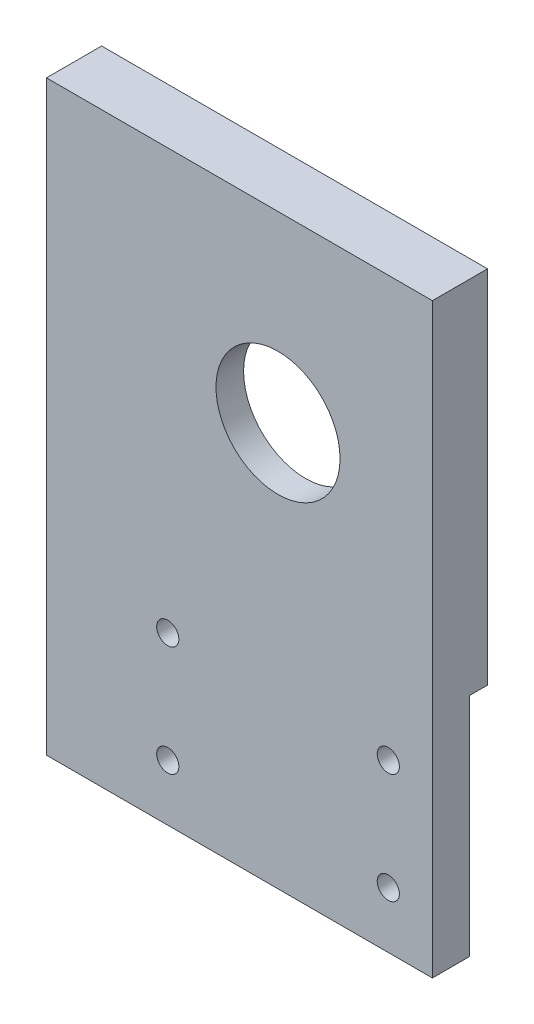
ISO-10303-21;
HEADER;
FILE_DESCRIPTION(('STEP AP214'),'2;1');
FILE_NAME('part.step','',(''),(''),'','','');
FILE_SCHEMA(('AUTOMOTIVE_DESIGN { 1 0 10303 214 1 1 1 1 }'));
ENDSEC;
DATA;
#1=APPLICATION_CONTEXT('core data for automotive mechanical design processes');
#2=APPLICATION_PROTOCOL_DEFINITION('international standard','automotive_design',2000,#1);
#3=PRODUCT_CONTEXT('',#1,'mechanical');
#4=PRODUCT('Part','Part','',(#3));
#5=PRODUCT_RELATED_PRODUCT_CATEGORY('part','',(#4));
#6=PRODUCT_DEFINITION_FORMATION('','',#4);
#7=PRODUCT_DEFINITION_CONTEXT('part definition',#1,'design');
#8=PRODUCT_DEFINITION('design','',#6,#7);
#9=PRODUCT_DEFINITION_SHAPE('','',#8);
#10=(LENGTH_UNIT() NAMED_UNIT(*) SI_UNIT(.MILLI.,.METRE.));
#11=(NAMED_UNIT(*) PLANE_ANGLE_UNIT() SI_UNIT($,.RADIAN.));
#12=(NAMED_UNIT(*) SI_UNIT($,.STERADIAN.) SOLID_ANGLE_UNIT());
#13=UNCERTAINTY_MEASURE_WITH_UNIT(LENGTH_MEASURE(1.E-05),#10,'distance_accuracy_value','');
#14=(GEOMETRIC_REPRESENTATION_CONTEXT(3) GLOBAL_UNCERTAINTY_ASSIGNED_CONTEXT((#13)) GLOBAL_UNIT_ASSIGNED_CONTEXT((#10,
#11,#12)) REPRESENTATION_CONTEXT('',''));
#15=CARTESIAN_POINT('',(0.,0.,0.));
#16=DIRECTION('',(0.,0.,1.));
#17=DIRECTION('',(1.,0.,0.));
#18=AXIS2_PLACEMENT_3D('',#15,#16,#17);
#19=CARTESIAN_POINT('',(0.,0.,-12.7));
#20=DIRECTION('',(1.,0.,0.));
#21=DIRECTION('',(0.,1.,0.));
#22=AXIS2_PLACEMENT_3D('',#19,#20,#21);
#23=PLANE('',#22);
#24=DIRECTION('',(0.,-1.,0.));
#25=VECTOR('',#24,1.);
#26=CARTESIAN_POINT('',(0.,-135.128,-8.5725));
#27=LINE('',#26,#25);
#28=CARTESIAN_POINT('',(0.,-83.058,-8.5725));
#29=VERTEX_POINT('',#28);
#30=CARTESIAN_POINT('',(0.,-135.128,-8.5725));
#31=VERTEX_POINT('',#30);
#32=EDGE_CURVE('E145',#29,#31,#27,.T.);
#33=ORIENTED_EDGE('',*,*,#32,.T.);
#34=DIRECTION('',(0.,0.,1.));
#35=VECTOR('',#34,1.);
#36=CARTESIAN_POINT('',(0.,-135.128,-12.7));
#37=LINE('',#36,#35);
#38=CARTESIAN_POINT('',(0.,-135.128,0.));
#39=VERTEX_POINT('',#38);
#40=EDGE_CURVE('E153',#31,#39,#37,.T.);
#41=ORIENTED_EDGE('',*,*,#40,.T.);
#42=DIRECTION('',(0.,-1.,0.));
#43=VECTOR('',#42,1.);
#44=CARTESIAN_POINT('',(0.,0.,0.));
#45=LINE('',#44,#43);
#46=CARTESIAN_POINT('',(0.,0.,0.));
#47=VERTEX_POINT('',#46);
#48=EDGE_CURVE('E205',#47,#39,#45,.T.);
#49=ORIENTED_EDGE('',*,*,#48,.F.);
#50=DIRECTION('',(0.,0.,1.));
#51=VECTOR('',#50,1.);
#52=CARTESIAN_POINT('',(0.,0.,-12.7));
#53=LINE('',#52,#51);
#54=CARTESIAN_POINT('',(0.,0.,-12.7));
#55=VERTEX_POINT('',#54);
#56=EDGE_CURVE('E214',#55,#47,#53,.T.);
#57=ORIENTED_EDGE('',*,*,#56,.F.);
#58=DIRECTION('',(0.,-1.,0.));
#59=VECTOR('',#58,1.);
#60=CARTESIAN_POINT('',(0.,0.,-12.7));
#61=LINE('',#60,#59);
#62=CARTESIAN_POINT('',(0.,-83.058,-12.7));
#63=VERTEX_POINT('',#62);
#64=EDGE_CURVE('E206',#55,#63,#61,.T.);
#65=ORIENTED_EDGE('',*,*,#64,.T.);
#66=DIRECTION('',(0.,0.,-1.));
#67=VECTOR('',#66,1.);
#68=CARTESIAN_POINT('',(0.,-83.058,-8.5725));
#69=LINE('',#68,#67);
#70=EDGE_CURVE('E165',#29,#63,#69,.T.);
#71=ORIENTED_EDGE('',*,*,#70,.F.);
#72=EDGE_LOOP('',(#33,#41,#49,#57,#65,#71));
#73=FACE_BOUND('',#72,.T.);
#74=ADVANCED_FACE('F39',(#73),#23,.F.);
#75=CARTESIAN_POINT('',(0.,-135.128,-12.7));
#76=DIRECTION('',(0.,1.,0.));
#77=DIRECTION('',(0.,0.,-1.));
#78=AXIS2_PLACEMENT_3D('',#75,#76,#77);
#79=PLANE('',#78);
#80=DIRECTION('',(0.,0.,1.));
#81=VECTOR('',#80,1.);
#82=CARTESIAN_POINT('',(88.9,-135.128,-12.7));
#83=LINE('',#82,#81);
#84=CARTESIAN_POINT('',(88.9,-135.128,-8.5725));
#85=VERTEX_POINT('',#84);
#86=CARTESIAN_POINT('',(88.9,-135.128,0.));
#87=VERTEX_POINT('',#86);
#88=EDGE_CURVE('E161',#85,#87,#83,.T.);
#89=ORIENTED_EDGE('',*,*,#88,.T.);
#90=DIRECTION('',(1.,0.,0.));
#91=VECTOR('',#90,1.);
#92=CARTESIAN_POINT('',(0.,-135.128,0.));
#93=LINE('',#92,#91);
#94=EDGE_CURVE('E156',#39,#87,#93,.T.);
#95=ORIENTED_EDGE('',*,*,#94,.F.);
#96=ORIENTED_EDGE('',*,*,#40,.F.);
#97=DIRECTION('',(1.,0.,0.));
#98=VECTOR('',#97,1.);
#99=CARTESIAN_POINT('',(0.,-135.128,-8.5725));
#100=LINE('',#99,#98);
#101=EDGE_CURVE('E141',#31,#85,#100,.T.);
#102=ORIENTED_EDGE('',*,*,#101,.T.);
#103=EDGE_LOOP('',(#89,#95,#96,#102));
#104=FACE_BOUND('',#103,.T.);
#105=ADVANCED_FACE('F154',(#104),#79,.F.);
#106=CARTESIAN_POINT('',(88.9,0.,-12.7));
#107=DIRECTION('',(-1.,0.,0.));
#108=DIRECTION('',(0.,-1.,0.));
#109=AXIS2_PLACEMENT_3D('',#106,#107,#108);
#110=PLANE('',#109);
#111=DIRECTION('',(0.,1.,0.));
#112=VECTOR('',#111,1.);
#113=CARTESIAN_POINT('',(88.9,0.,-12.7));
#114=LINE('',#113,#112);
#115=CARTESIAN_POINT('',(88.9,-83.058,-12.7));
#116=VERTEX_POINT('',#115);
#117=CARTESIAN_POINT('',(88.9,0.,-12.7));
#118=VERTEX_POINT('',#117);
#119=EDGE_CURVE('E208',#116,#118,#114,.T.);
#120=ORIENTED_EDGE('',*,*,#119,.T.);
#121=DIRECTION('',(0.,0.,1.));
#122=VECTOR('',#121,1.);
#123=CARTESIAN_POINT('',(88.9,0.,-12.7));
#124=LINE('',#123,#122);
#125=CARTESIAN_POINT('',(88.9,0.,0.));
#126=VERTEX_POINT('',#125);
#127=EDGE_CURVE('E223',#118,#126,#124,.T.);
#128=ORIENTED_EDGE('',*,*,#127,.T.);
#129=DIRECTION('',(0.,1.,0.));
#130=VECTOR('',#129,1.);
#131=CARTESIAN_POINT('',(88.9,0.,0.));
#132=LINE('',#131,#130);
#133=EDGE_CURVE('E217',#87,#126,#132,.T.);
#134=ORIENTED_EDGE('',*,*,#133,.F.);
#135=ORIENTED_EDGE('',*,*,#88,.F.);
#136=DIRECTION('',(0.,1.,0.));
#137=VECTOR('',#136,1.);
#138=CARTESIAN_POINT('',(88.9,-135.128,-8.5725));
#139=LINE('',#138,#137);
#140=CARTESIAN_POINT('',(88.9,-83.058,-8.5725));
#141=VERTEX_POINT('',#140);
#142=EDGE_CURVE('E147',#85,#141,#139,.T.);
#143=ORIENTED_EDGE('',*,*,#142,.T.);
#144=DIRECTION('',(0.,0.,-1.));
#145=VECTOR('',#144,1.);
#146=CARTESIAN_POINT('',(88.9,-83.058,-8.5725));
#147=LINE('',#146,#145);
#148=EDGE_CURVE('E174',#141,#116,#147,.T.);
#149=ORIENTED_EDGE('',*,*,#148,.T.);
#150=EDGE_LOOP('',(#120,#128,#134,#135,#143,#149));
#151=FACE_BOUND('',#150,.T.);
#152=ADVANCED_FACE('F307',(#151),#110,.F.);
#153=CARTESIAN_POINT('',(0.,0.,-12.7));
#154=DIRECTION('',(0.,-1.,0.));
#155=DIRECTION('',(0.,0.,1.));
#156=AXIS2_PLACEMENT_3D('',#153,#154,#155);
#157=PLANE('',#156);
#158=DIRECTION('',(-1.,0.,0.));
#159=VECTOR('',#158,1.);
#160=CARTESIAN_POINT('',(0.,0.,0.));
#161=LINE('',#160,#159);
#162=EDGE_CURVE('E209',#126,#47,#161,.T.);
#163=ORIENTED_EDGE('',*,*,#162,.F.);
#164=ORIENTED_EDGE('',*,*,#127,.F.);
#165=DIRECTION('',(-1.,0.,0.));
#166=VECTOR('',#165,1.);
#167=CARTESIAN_POINT('',(0.,0.,-12.7));
#168=LINE('',#167,#166);
#169=EDGE_CURVE('E212',#118,#55,#168,.T.);
#170=ORIENTED_EDGE('',*,*,#169,.T.);
#171=ORIENTED_EDGE('',*,*,#56,.T.);
#172=EDGE_LOOP('',(#163,#164,#170,#171));
#173=FACE_BOUND('',#172,.T.);
#174=ADVANCED_FACE('F312',(#173),#157,.F.);
#175=CARTESIAN_POINT('',(0.,0.,-12.7));
#176=DIRECTION('',(0.,0.,-1.));
#177=DIRECTION('',(1.,0.,0.));
#178=AXIS2_PLACEMENT_3D('',#175,#176,#177);
#179=PLANE('',#178);
#180=DIRECTION('',(-1.,0.,0.));
#181=VECTOR('',#180,1.);
#182=CARTESIAN_POINT('',(0.,-83.058,-12.7));
#183=LINE('',#182,#181);
#184=EDGE_CURVE('E54',#116,#63,#183,.T.);
#185=ORIENTED_EDGE('',*,*,#184,.T.);
#186=ORIENTED_EDGE('',*,*,#64,.F.);
#187=ORIENTED_EDGE('',*,*,#169,.F.);
#188=ORIENTED_EDGE('',*,*,#119,.F.);
#189=EDGE_LOOP('',(#185,#186,#187,#188));
#190=FACE_BOUND('',#189,.T.);
#191=DIRECTION('',(0.,1.,0.));
#192=VECTOR('',#191,1.);
#193=CARTESIAN_POINT('',(85.09,-73.914,-12.7));
#194=LINE('',#193,#192);
#195=CARTESIAN_POINT('',(85.09,-64.389,-12.7));
#196=VERTEX_POINT('',#195);
#197=CARTESIAN_POINT('',(85.09,-19.939,-12.7));
#198=VERTEX_POINT('',#197);
#199=EDGE_CURVE('E177',#196,#198,#194,.T.);
#200=ORIENTED_EDGE('',*,*,#199,.T.);
#201=CARTESIAN_POINT('',(75.565,-19.939,-12.7));
#202=DIRECTION('',(0.,0.,1.));
#203=DIRECTION('',(1.,0.,0.));
#204=AXIS2_PLACEMENT_3D('',#201,#202,#203);
#205=CIRCLE('',#204,9.525);
#206=CARTESIAN_POINT('',(75.565,-10.414,-12.7));
#207=VERTEX_POINT('',#206);
#208=EDGE_CURVE('E47',#207,#198,#205,.F.);
#209=ORIENTED_EDGE('',*,*,#208,.F.);
#210=DIRECTION('',(-1.,0.,0.));
#211=VECTOR('',#210,1.);
#212=CARTESIAN_POINT('',(21.59,-10.414,-12.7));
#213=LINE('',#212,#211);
#214=CARTESIAN_POINT('',(31.115,-10.414,-12.7));
#215=VERTEX_POINT('',#214);
#216=EDGE_CURVE('E194',#207,#215,#213,.T.);
#217=ORIENTED_EDGE('',*,*,#216,.T.);
#218=CARTESIAN_POINT('',(31.115,-19.939,-12.7));
#219=DIRECTION('',(0.,0.,1.));
#220=DIRECTION('',(1.,0.,0.));
#221=AXIS2_PLACEMENT_3D('',#218,#219,#220);
#222=CIRCLE('',#221,9.525);
#223=CARTESIAN_POINT('',(21.59,-19.939,-12.7));
#224=VERTEX_POINT('',#223);
#225=EDGE_CURVE('E11',#224,#215,#222,.F.);
#226=ORIENTED_EDGE('',*,*,#225,.F.);
#227=DIRECTION('',(0.,-1.,0.));
#228=VECTOR('',#227,1.);
#229=CARTESIAN_POINT('',(21.59,-73.914,-12.7));
#230=LINE('',#229,#228);
#231=CARTESIAN_POINT('',(21.59,-64.389,-12.7));
#232=VERTEX_POINT('',#231);
#233=EDGE_CURVE('E197',#224,#232,#230,.T.);
#234=ORIENTED_EDGE('',*,*,#233,.T.);
#235=CARTESIAN_POINT('',(31.115,-64.389,-12.7));
#236=DIRECTION('',(0.,0.,1.));
#237=DIRECTION('',(1.,0.,0.));
#238=AXIS2_PLACEMENT_3D('',#235,#236,#237);
#239=CIRCLE('',#238,9.525);
#240=CARTESIAN_POINT('',(31.115,-73.914,-12.7));
#241=VERTEX_POINT('',#240);
#242=EDGE_CURVE('E255',#241,#232,#239,.F.);
#243=ORIENTED_EDGE('',*,*,#242,.F.);
#244=DIRECTION('',(1.,0.,0.));
#245=VECTOR('',#244,1.);
#246=CARTESIAN_POINT('',(21.59,-73.914,-12.7));
#247=LINE('',#246,#245);
#248=CARTESIAN_POINT('',(75.565,-73.914,-12.7));
#249=VERTEX_POINT('',#248);
#250=EDGE_CURVE('E183',#241,#249,#247,.T.);
#251=ORIENTED_EDGE('',*,*,#250,.T.);
#252=CARTESIAN_POINT('',(75.565,-64.389,-12.7));
#253=DIRECTION('',(0.,0.,1.));
#254=DIRECTION('',(1.,0.,0.));
#255=AXIS2_PLACEMENT_3D('',#252,#253,#254);
#256=CIRCLE('',#255,9.525);
#257=EDGE_CURVE('E258',#196,#249,#256,.F.);
#258=ORIENTED_EDGE('',*,*,#257,.F.);
#259=EDGE_LOOP('',(#200,#209,#217,#226,#234,#243,#251,#258));
#260=FACE_BOUND('',#259,.T.);
#261=ADVANCED_FACE('F267',(#190,#260),#179,.T.);
#262=CARTESIAN_POINT('',(0.,0.,0.));
#263=DIRECTION('',(0.,0.,-1.));
#264=DIRECTION('',(1.,0.,0.));
#265=AXIS2_PLACEMENT_3D('',#262,#263,#264);
#266=PLANE('',#265);
#267=CARTESIAN_POINT('',(78.74,-96.774,0.));
#268=DIRECTION('',(0.,0.,-1.));
#269=DIRECTION('',(-1.,0.,0.));
#270=AXIS2_PLACEMENT_3D('',#267,#268,#269);
#271=CIRCLE('',#270,2.55269999999999);
#272=CARTESIAN_POINT('',(76.1873,-96.774,0.));
#273=VERTEX_POINT('',#272);
#274=EDGE_CURVE('E364',#273,#273,#271,.T.);
#275=ORIENTED_EDGE('',*,*,#274,.T.);
#276=EDGE_LOOP('',(#275));
#277=FACE_BOUND('',#276,.T.);
#278=CARTESIAN_POINT('',(78.74,-122.174,0.));
#279=DIRECTION('',(0.,0.,-1.));
#280=DIRECTION('',(-1.,0.,0.));
#281=AXIS2_PLACEMENT_3D('',#278,#279,#280);
#282=CIRCLE('',#281,2.55269999999999);
#283=CARTESIAN_POINT('',(76.1873,-122.174,0.));
#284=VERTEX_POINT('',#283);
#285=EDGE_CURVE('E374',#284,#284,#282,.T.);
#286=ORIENTED_EDGE('',*,*,#285,.T.);
#287=EDGE_LOOP('',(#286));
#288=FACE_BOUND('',#287,.T.);
#289=CARTESIAN_POINT('',(27.94,-122.174,0.));
#290=DIRECTION('',(0.,0.,-1.));
#291=DIRECTION('',(-1.,0.,0.));
#292=AXIS2_PLACEMENT_3D('',#289,#290,#291);
#293=CIRCLE('',#292,2.5527);
#294=CARTESIAN_POINT('',(25.3873,-122.174,0.));
#295=VERTEX_POINT('',#294);
#296=EDGE_CURVE('E380',#295,#295,#293,.T.);
#297=ORIENTED_EDGE('',*,*,#296,.T.);
#298=EDGE_LOOP('',(#297));
#299=FACE_BOUND('',#298,.T.);
#300=CARTESIAN_POINT('',(27.94,-96.774,0.));
#301=DIRECTION('',(0.,0.,-1.));
#302=DIRECTION('',(-1.,0.,0.));
#303=AXIS2_PLACEMENT_3D('',#300,#301,#302);
#304=CIRCLE('',#303,2.5527);
#305=CARTESIAN_POINT('',(25.3873,-96.774,0.));
#306=VERTEX_POINT('',#305);
#307=EDGE_CURVE('E167',#306,#306,#304,.T.);
#308=ORIENTED_EDGE('',*,*,#307,.T.);
#309=EDGE_LOOP('',(#308));
#310=FACE_BOUND('',#309,.T.);
#311=CARTESIAN_POINT('',(53.34,-42.164,0.));
#312=DIRECTION('',(0.,0.,1.));
#313=DIRECTION('',(1.,0.,0.));
#314=AXIS2_PLACEMENT_3D('',#311,#312,#313);
#315=CIRCLE('',#314,14.2875);
#316=CARTESIAN_POINT('',(67.6275,-42.164,0.));
#317=VERTEX_POINT('',#316);
#318=EDGE_CURVE('E202',#317,#317,#315,.T.);
#319=ORIENTED_EDGE('',*,*,#318,.F.);
#320=EDGE_LOOP('',(#319));
#321=FACE_BOUND('',#320,.T.);
#322=ORIENTED_EDGE('',*,*,#48,.T.);
#323=ORIENTED_EDGE('',*,*,#94,.T.);
#324=ORIENTED_EDGE('',*,*,#133,.T.);
#325=ORIENTED_EDGE('',*,*,#162,.T.);
#326=EDGE_LOOP('',(#322,#323,#324,#325));
#327=FACE_BOUND('',#326,.T.);
#328=ADVANCED_FACE('F317',(#277,#288,#299,#310,#321,#327),#266,.F.);
#329=CARTESIAN_POINT('',(53.34,-42.164,0.));
#330=DIRECTION('',(0.,0.,-1.));
#331=DIRECTION('',(1.,0.,0.));
#332=AXIS2_PLACEMENT_3D('',#329,#330,#331);
#333=CYLINDRICAL_SURFACE('',#332,14.2875);
#334=CARTESIAN_POINT('',(53.34,-42.164,-6.35));
#335=DIRECTION('',(0.,0.,-1.));
#336=DIRECTION('',(-1.,0.,0.));
#337=AXIS2_PLACEMENT_3D('',#334,#335,#336);
#338=CIRCLE('',#337,14.2875);
#339=CARTESIAN_POINT('',(39.0525,-42.164,-6.35));
#340=VERTEX_POINT('',#339);
#341=EDGE_CURVE('E191',#340,#340,#338,.F.);
#342=ORIENTED_EDGE('',*,*,#341,.F.);
#343=EDGE_LOOP('',(#342));
#344=FACE_BOUND('',#343,.T.);
#345=ORIENTED_EDGE('',*,*,#318,.T.);
#346=EDGE_LOOP('',(#345));
#347=FACE_BOUND('',#346,.T.);
#348=ADVANCED_FACE('F320',(#344,#347),#333,.F.);
#349=CARTESIAN_POINT('',(0.,0.,-6.35));
#350=DIRECTION('',(0.,0.,1.));
#351=DIRECTION('',(-1.,0.,0.));
#352=AXIS2_PLACEMENT_3D('',#349,#350,#351);
#353=PLANE('',#352);
#354=DIRECTION('',(0.,-1.,0.));
#355=VECTOR('',#354,1.);
#356=CARTESIAN_POINT('',(21.59,-73.914,-6.35));
#357=LINE('',#356,#355);
#358=CARTESIAN_POINT('',(21.59,-19.939,-6.35));
#359=VERTEX_POINT('',#358);
#360=CARTESIAN_POINT('',(21.59,-64.389,-6.35));
#361=VERTEX_POINT('',#360);
#362=EDGE_CURVE('E185',#359,#361,#357,.T.);
#363=ORIENTED_EDGE('',*,*,#362,.F.);
#364=CARTESIAN_POINT('',(31.115,-19.939,-6.35));
#365=DIRECTION('',(0.,0.,-1.));
#366=DIRECTION('',(-1.,0.,0.));
#367=AXIS2_PLACEMENT_3D('',#364,#365,#366);
#368=CIRCLE('',#367,9.525);
#369=CARTESIAN_POINT('',(31.115,-10.414,-6.35));
#370=VERTEX_POINT('',#369);
#371=EDGE_CURVE('E236',#370,#359,#368,.F.);
#372=ORIENTED_EDGE('',*,*,#371,.F.);
#373=DIRECTION('',(-1.,0.,0.));
#374=VECTOR('',#373,1.);
#375=CARTESIAN_POINT('',(21.59,-10.414,-6.35));
#376=LINE('',#375,#374);
#377=CARTESIAN_POINT('',(75.565,-10.414,-6.35));
#378=VERTEX_POINT('',#377);
#379=EDGE_CURVE('E182',#378,#370,#376,.T.);
#380=ORIENTED_EDGE('',*,*,#379,.F.);
#381=CARTESIAN_POINT('',(75.565,-19.939,-6.35));
#382=DIRECTION('',(0.,0.,-1.));
#383=DIRECTION('',(-1.,0.,0.));
#384=AXIS2_PLACEMENT_3D('',#381,#382,#383);
#385=CIRCLE('',#384,9.525);
#386=CARTESIAN_POINT('',(85.09,-19.939,-6.35));
#387=VERTEX_POINT('',#386);
#388=EDGE_CURVE('E239',#387,#378,#385,.F.);
#389=ORIENTED_EDGE('',*,*,#388,.F.);
#390=DIRECTION('',(0.,1.,0.));
#391=VECTOR('',#390,1.);
#392=CARTESIAN_POINT('',(85.09,-73.914,-6.35));
#393=LINE('',#392,#391);
#394=CARTESIAN_POINT('',(85.09,-64.389,-6.35));
#395=VERTEX_POINT('',#394);
#396=EDGE_CURVE('E179',#395,#387,#393,.T.);
#397=ORIENTED_EDGE('',*,*,#396,.F.);
#398=CARTESIAN_POINT('',(75.565,-64.389,-6.35));
#399=DIRECTION('',(0.,0.,-1.));
#400=DIRECTION('',(-1.,0.,0.));
#401=AXIS2_PLACEMENT_3D('',#398,#399,#400);
#402=CIRCLE('',#401,9.525);
#403=CARTESIAN_POINT('',(75.565,-73.914,-6.35));
#404=VERTEX_POINT('',#403);
#405=EDGE_CURVE('E242',#404,#395,#402,.F.);
#406=ORIENTED_EDGE('',*,*,#405,.F.);
#407=DIRECTION('',(1.,0.,0.));
#408=VECTOR('',#407,1.);
#409=CARTESIAN_POINT('',(21.59,-73.914,-6.35));
#410=LINE('',#409,#408);
#411=CARTESIAN_POINT('',(31.115,-73.914,-6.35));
#412=VERTEX_POINT('',#411);
#413=EDGE_CURVE('E188',#412,#404,#410,.T.);
#414=ORIENTED_EDGE('',*,*,#413,.F.);
#415=CARTESIAN_POINT('',(31.115,-64.389,-6.35));
#416=DIRECTION('',(0.,0.,-1.));
#417=DIRECTION('',(-1.,0.,0.));
#418=AXIS2_PLACEMENT_3D('',#415,#416,#417);
#419=CIRCLE('',#418,9.525);
#420=EDGE_CURVE('E245',#361,#412,#419,.F.);
#421=ORIENTED_EDGE('',*,*,#420,.F.);
#422=EDGE_LOOP('',(#363,#372,#380,#389,#397,#406,#414,#421));
#423=FACE_BOUND('',#422,.T.);
#424=ORIENTED_EDGE('',*,*,#341,.T.);
#425=EDGE_LOOP('',(#424));
#426=FACE_BOUND('',#425,.T.);
#427=ADVANCED_FACE('F276',(#423,#426),#353,.F.);
#428=CARTESIAN_POINT('',(85.09,-73.914,-6.35));
#429=DIRECTION('',(1.,0.,0.));
#430=DIRECTION('',(0.,0.,1.));
#431=AXIS2_PLACEMENT_3D('',#428,#429,#430);
#432=PLANE('',#431);
#433=ORIENTED_EDGE('',*,*,#396,.T.);
#434=DIRECTION('',(0.,0.,-1.));
#435=VECTOR('',#434,1.);
#436=CARTESIAN_POINT('',(85.09,-19.939,-6.35));
#437=LINE('',#436,#435);
#438=EDGE_CURVE('E248',#198,#387,#437,.F.);
#439=ORIENTED_EDGE('',*,*,#438,.F.);
#440=ORIENTED_EDGE('',*,*,#199,.F.);
#441=DIRECTION('',(0.,0.,-1.));
#442=VECTOR('',#441,1.);
#443=CARTESIAN_POINT('',(85.09,-64.389,-12.7));
#444=LINE('',#443,#442);
#445=EDGE_CURVE('E250',#395,#196,#444,.T.);
#446=ORIENTED_EDGE('',*,*,#445,.F.);
#447=EDGE_LOOP('',(#433,#439,#440,#446));
#448=FACE_BOUND('',#447,.T.);
#449=ADVANCED_FACE('F269',(#448),#432,.F.);
#450=CARTESIAN_POINT('',(21.59,-73.914,-6.35));
#451=DIRECTION('',(0.,-1.,0.));
#452=DIRECTION('',(0.,0.,1.));
#453=AXIS2_PLACEMENT_3D('',#450,#451,#452);
#454=PLANE('',#453);
#455=ORIENTED_EDGE('',*,*,#413,.T.);
#456=DIRECTION('',(0.,0.,-1.));
#457=VECTOR('',#456,1.);
#458=CARTESIAN_POINT('',(75.565,-73.914,-6.35));
#459=LINE('',#458,#457);
#460=EDGE_CURVE('E160',#249,#404,#459,.F.);
#461=ORIENTED_EDGE('',*,*,#460,.F.);
#462=ORIENTED_EDGE('',*,*,#250,.F.);
#463=DIRECTION('',(0.,0.,-1.));
#464=VECTOR('',#463,1.);
#465=CARTESIAN_POINT('',(31.115,-73.914,-12.7));
#466=LINE('',#465,#464);
#467=EDGE_CURVE('E230',#412,#241,#466,.T.);
#468=ORIENTED_EDGE('',*,*,#467,.F.);
#469=EDGE_LOOP('',(#455,#461,#462,#468));
#470=FACE_BOUND('',#469,.T.);
#471=ADVANCED_FACE('F291',(#470),#454,.F.);
#472=CARTESIAN_POINT('',(21.59,-73.914,-6.35));
#473=DIRECTION('',(-1.,0.,0.));
#474=DIRECTION('',(0.,0.,-1.));
#475=AXIS2_PLACEMENT_3D('',#472,#473,#474);
#476=PLANE('',#475);
#477=ORIENTED_EDGE('',*,*,#233,.F.);
#478=DIRECTION('',(0.,0.,-1.));
#479=VECTOR('',#478,1.);
#480=CARTESIAN_POINT('',(21.59,-19.939,-12.7));
#481=LINE('',#480,#479);
#482=EDGE_CURVE('E232',#359,#224,#481,.T.);
#483=ORIENTED_EDGE('',*,*,#482,.F.);
#484=ORIENTED_EDGE('',*,*,#362,.T.);
#485=DIRECTION('',(0.,0.,-1.));
#486=VECTOR('',#485,1.);
#487=CARTESIAN_POINT('',(21.59,-64.389,-6.35));
#488=LINE('',#487,#486);
#489=EDGE_CURVE('E234',#232,#361,#488,.F.);
#490=ORIENTED_EDGE('',*,*,#489,.F.);
#491=EDGE_LOOP('',(#477,#483,#484,#490));
#492=FACE_BOUND('',#491,.T.);
#493=ADVANCED_FACE('F285',(#492),#476,.F.);
#494=CARTESIAN_POINT('',(21.59,-10.414,-6.35));
#495=DIRECTION('',(0.,1.,0.));
#496=DIRECTION('',(0.,0.,-1.));
#497=AXIS2_PLACEMENT_3D('',#494,#495,#496);
#498=PLANE('',#497);
#499=ORIENTED_EDGE('',*,*,#379,.T.);
#500=DIRECTION('',(0.,0.,-1.));
#501=VECTOR('',#500,1.);
#502=CARTESIAN_POINT('',(31.115,-10.414,-6.35));
#503=LINE('',#502,#501);
#504=EDGE_CURVE('E62',#215,#370,#503,.F.);
#505=ORIENTED_EDGE('',*,*,#504,.F.);
#506=ORIENTED_EDGE('',*,*,#216,.F.);
#507=DIRECTION('',(0.,0.,-1.));
#508=VECTOR('',#507,1.);
#509=CARTESIAN_POINT('',(75.565,-10.414,-12.7));
#510=LINE('',#509,#508);
#511=EDGE_CURVE('E253',#378,#207,#510,.T.);
#512=ORIENTED_EDGE('',*,*,#511,.F.);
#513=EDGE_LOOP('',(#499,#505,#506,#512));
#514=FACE_BOUND('',#513,.T.);
#515=ADVANCED_FACE('F279',(#514),#498,.F.);
#516=CARTESIAN_POINT('',(31.115,-64.389,-6.35));
#517=DIRECTION('',(0.,0.,1.));
#518=DIRECTION('',(-1.,0.,0.));
#519=AXIS2_PLACEMENT_3D('',#516,#517,#518);
#520=CYLINDRICAL_SURFACE('',#519,9.525);
#521=ORIENTED_EDGE('',*,*,#420,.T.);
#522=ORIENTED_EDGE('',*,*,#467,.T.);
#523=ORIENTED_EDGE('',*,*,#242,.T.);
#524=ORIENTED_EDGE('',*,*,#489,.T.);
#525=EDGE_LOOP('',(#521,#522,#523,#524));
#526=FACE_BOUND('',#525,.T.);
#527=ADVANCED_FACE('F288',(#526),#520,.F.);
#528=CARTESIAN_POINT('',(75.565,-64.389,-6.35));
#529=DIRECTION('',(0.,0.,1.));
#530=DIRECTION('',(-1.,0.,0.));
#531=AXIS2_PLACEMENT_3D('',#528,#529,#530);
#532=CYLINDRICAL_SURFACE('',#531,9.525);
#533=ORIENTED_EDGE('',*,*,#405,.T.);
#534=ORIENTED_EDGE('',*,*,#445,.T.);
#535=ORIENTED_EDGE('',*,*,#257,.T.);
#536=ORIENTED_EDGE('',*,*,#460,.T.);
#537=EDGE_LOOP('',(#533,#534,#535,#536));
#538=FACE_BOUND('',#537,.T.);
#539=ADVANCED_FACE('F294',(#538),#532,.F.);
#540=CARTESIAN_POINT('',(75.565,-19.939,-6.35));
#541=DIRECTION('',(0.,0.,1.));
#542=DIRECTION('',(-1.,0.,0.));
#543=AXIS2_PLACEMENT_3D('',#540,#541,#542);
#544=CYLINDRICAL_SURFACE('',#543,9.525);
#545=ORIENTED_EDGE('',*,*,#388,.T.);
#546=ORIENTED_EDGE('',*,*,#511,.T.);
#547=ORIENTED_EDGE('',*,*,#208,.T.);
#548=ORIENTED_EDGE('',*,*,#438,.T.);
#549=EDGE_LOOP('',(#545,#546,#547,#548));
#550=FACE_BOUND('',#549,.T.);
#551=ADVANCED_FACE('F263',(#550),#544,.F.);
#552=CARTESIAN_POINT('',(31.115,-19.939,-6.35));
#553=DIRECTION('',(0.,0.,1.));
#554=DIRECTION('',(-1.,0.,0.));
#555=AXIS2_PLACEMENT_3D('',#552,#553,#554);
#556=CYLINDRICAL_SURFACE('',#555,9.525);
#557=ORIENTED_EDGE('',*,*,#371,.T.);
#558=ORIENTED_EDGE('',*,*,#482,.T.);
#559=ORIENTED_EDGE('',*,*,#225,.T.);
#560=ORIENTED_EDGE('',*,*,#504,.T.);
#561=EDGE_LOOP('',(#557,#558,#559,#560));
#562=FACE_BOUND('',#561,.T.);
#563=ADVANCED_FACE('F41',(#562),#556,.F.);
#564=CARTESIAN_POINT('',(0.,0.,-8.5725));
#565=DIRECTION('',(0.,0.,1.));
#566=DIRECTION('',(-1.,0.,0.));
#567=AXIS2_PLACEMENT_3D('',#564,#565,#566);
#568=PLANE('',#567);
#569=CARTESIAN_POINT('',(78.74,-96.774,-8.5725));
#570=DIRECTION('',(0.,0.,-1.));
#571=DIRECTION('',(-1.,0.,0.));
#572=AXIS2_PLACEMENT_3D('',#569,#570,#571);
#573=CIRCLE('',#572,2.55269999999999);
#574=CARTESIAN_POINT('',(76.1873,-96.774,-8.5725));
#575=VERTEX_POINT('',#574);
#576=EDGE_CURVE('E367',#575,#575,#573,.T.);
#577=ORIENTED_EDGE('',*,*,#576,.F.);
#578=EDGE_LOOP('',(#577));
#579=FACE_BOUND('',#578,.T.);
#580=CARTESIAN_POINT('',(78.74,-122.174,-8.5725));
#581=DIRECTION('',(0.,0.,-1.));
#582=DIRECTION('',(-1.,0.,0.));
#583=AXIS2_PLACEMENT_3D('',#580,#581,#582);
#584=CIRCLE('',#583,2.55269999999999);
#585=CARTESIAN_POINT('',(76.1873,-122.174,-8.5725));
#586=VERTEX_POINT('',#585);
#587=EDGE_CURVE('E369',#586,#586,#584,.T.);
#588=ORIENTED_EDGE('',*,*,#587,.F.);
#589=EDGE_LOOP('',(#588));
#590=FACE_BOUND('',#589,.T.);
#591=CARTESIAN_POINT('',(27.94,-122.174,-8.5725));
#592=DIRECTION('',(0.,0.,-1.));
#593=DIRECTION('',(-1.,0.,0.));
#594=AXIS2_PLACEMENT_3D('',#591,#592,#593);
#595=CIRCLE('',#594,2.55269999999999);
#596=CARTESIAN_POINT('',(25.3873,-122.174,-8.5725));
#597=VERTEX_POINT('',#596);
#598=EDGE_CURVE('E377',#597,#597,#595,.T.);
#599=ORIENTED_EDGE('',*,*,#598,.F.);
#600=EDGE_LOOP('',(#599));
#601=FACE_BOUND('',#600,.T.);
#602=CARTESIAN_POINT('',(27.94,-96.774,-8.5725));
#603=DIRECTION('',(0.,0.,-1.));
#604=DIRECTION('',(-1.,0.,0.));
#605=AXIS2_PLACEMENT_3D('',#602,#603,#604);
#606=CIRCLE('',#605,2.55269999999999);
#607=CARTESIAN_POINT('',(25.3873,-96.774,-8.5725));
#608=VERTEX_POINT('',#607);
#609=EDGE_CURVE('E382',#608,#608,#606,.T.);
#610=ORIENTED_EDGE('',*,*,#609,.F.);
#611=EDGE_LOOP('',(#610));
#612=FACE_BOUND('',#611,.T.);
#613=ORIENTED_EDGE('',*,*,#32,.F.);
#614=DIRECTION('',(-1.,0.,0.));
#615=VECTOR('',#614,1.);
#616=CARTESIAN_POINT('',(0.,-83.058,-8.5725));
#617=LINE('',#616,#615);
#618=EDGE_CURVE('E173',#141,#29,#617,.T.);
#619=ORIENTED_EDGE('',*,*,#618,.F.);
#620=ORIENTED_EDGE('',*,*,#142,.F.);
#621=ORIENTED_EDGE('',*,*,#101,.F.);
#622=EDGE_LOOP('',(#613,#619,#620,#621));
#623=FACE_BOUND('',#622,.T.);
#624=ADVANCED_FACE('F143',(#579,#590,#601,#612,#623),#568,.F.);
#625=CARTESIAN_POINT('',(0.,-83.058,-8.5725));
#626=DIRECTION('',(0.,1.,0.));
#627=DIRECTION('',(0.,0.,-1.));
#628=AXIS2_PLACEMENT_3D('',#625,#626,#627);
#629=PLANE('',#628);
#630=ORIENTED_EDGE('',*,*,#184,.F.);
#631=ORIENTED_EDGE('',*,*,#148,.F.);
#632=ORIENTED_EDGE('',*,*,#618,.T.);
#633=ORIENTED_EDGE('',*,*,#70,.T.);
#634=EDGE_LOOP('',(#630,#631,#632,#633));
#635=FACE_BOUND('',#634,.T.);
#636=ADVANCED_FACE('F338',(#635),#629,.F.);
#637=CARTESIAN_POINT('',(27.94,-96.774,-8.5725));
#638=DIRECTION('',(0.,0.,-1.));
#639=DIRECTION('',(-1.,0.,0.));
#640=AXIS2_PLACEMENT_3D('',#637,#638,#639);
#641=CYLINDRICAL_SURFACE('',#640,2.55269999999999);
#642=ORIENTED_EDGE('',*,*,#307,.F.);
#643=EDGE_LOOP('',(#642));
#644=FACE_BOUND('',#643,.T.);
#645=ORIENTED_EDGE('',*,*,#609,.T.);
#646=EDGE_LOOP('',(#645));
#647=FACE_BOUND('',#646,.T.);
#648=ADVANCED_FACE('F341',(#644,#647),#641,.F.);
#649=CARTESIAN_POINT('',(27.94,-122.174,-8.5725));
#650=DIRECTION('',(0.,0.,-1.));
#651=DIRECTION('',(-1.,0.,0.));
#652=AXIS2_PLACEMENT_3D('',#649,#650,#651);
#653=CYLINDRICAL_SURFACE('',#652,2.55269999999999);
#654=ORIENTED_EDGE('',*,*,#296,.F.);
#655=EDGE_LOOP('',(#654));
#656=FACE_BOUND('',#655,.T.);
#657=ORIENTED_EDGE('',*,*,#598,.T.);
#658=EDGE_LOOP('',(#657));
#659=FACE_BOUND('',#658,.T.);
#660=ADVANCED_FACE('F347',(#656,#659),#653,.F.);
#661=CARTESIAN_POINT('',(78.74,-122.174,-8.5725));
#662=DIRECTION('',(0.,0.,-1.));
#663=DIRECTION('',(-1.,0.,0.));
#664=AXIS2_PLACEMENT_3D('',#661,#662,#663);
#665=CYLINDRICAL_SURFACE('',#664,2.55269999999999);
#666=ORIENTED_EDGE('',*,*,#285,.F.);
#667=EDGE_LOOP('',(#666));
#668=FACE_BOUND('',#667,.T.);
#669=ORIENTED_EDGE('',*,*,#587,.T.);
#670=EDGE_LOOP('',(#669));
#671=FACE_BOUND('',#670,.T.);
#672=ADVANCED_FACE('F351',(#668,#671),#665,.F.);
#673=CARTESIAN_POINT('',(78.74,-96.774,-8.5725));
#674=DIRECTION('',(0.,0.,-1.));
#675=DIRECTION('',(-1.,0.,0.));
#676=AXIS2_PLACEMENT_3D('',#673,#674,#675);
#677=CYLINDRICAL_SURFACE('',#676,2.55269999999999);
#678=ORIENTED_EDGE('',*,*,#274,.F.);
#679=EDGE_LOOP('',(#678));
#680=FACE_BOUND('',#679,.T.);
#681=ORIENTED_EDGE('',*,*,#576,.T.);
#682=EDGE_LOOP('',(#681));
#683=FACE_BOUND('',#682,.T.);
#684=ADVANCED_FACE('F355',(#680,#683),#677,.F.);
#685=CLOSED_SHELL('',(#74,#105,#152,#174,#261,#328,#348,#427,#449,#471,#493,#515,#527,#539,#551,
#563,#624,#636,#648,#660,#672,#684));
#686=MANIFOLD_SOLID_BREP('B2',#685);
#687=ADVANCED_BREP_SHAPE_REPRESENTATION('',(#18,#686),#14);
#688=SHAPE_DEFINITION_REPRESENTATION(#9,#687);
ENDSEC;
END-ISO-10303-21;
